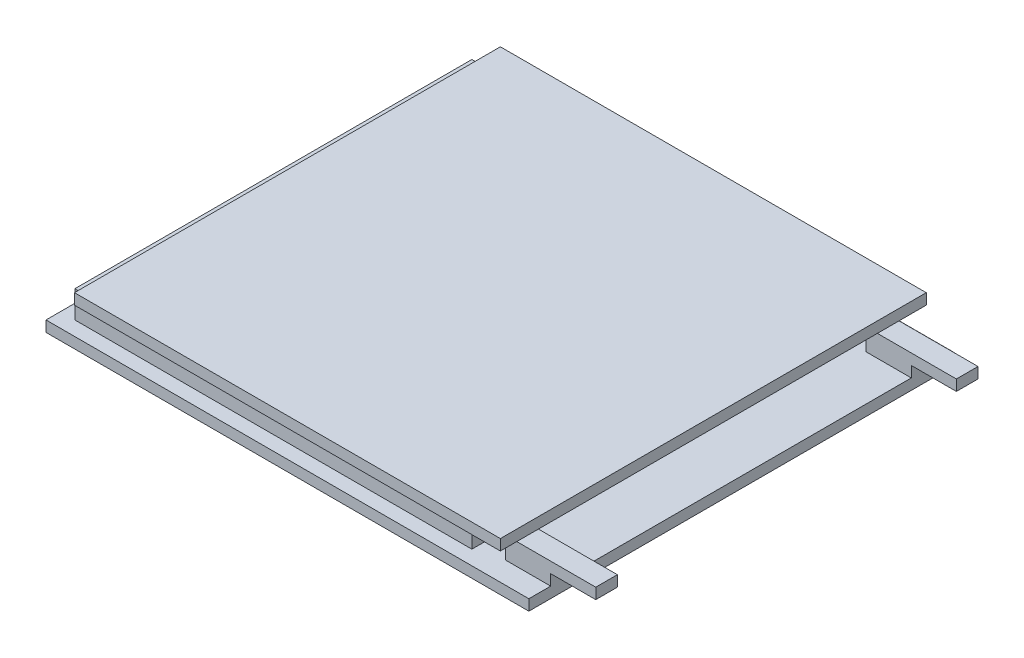
ISO-10303-21;
HEADER;
FILE_DESCRIPTION(('STEP AP214'),'2;1');
FILE_NAME('part.step','',(''),(''),'','','');
FILE_SCHEMA(('AUTOMOTIVE_DESIGN { 1 0 10303 214 1 1 1 1 }'));
ENDSEC;
DATA;
#1=APPLICATION_CONTEXT('core data for automotive mechanical design processes');
#2=APPLICATION_PROTOCOL_DEFINITION('international standard','automotive_design',2000,#1);
#3=PRODUCT_CONTEXT('',#1,'mechanical');
#4=PRODUCT('Part','Part','',(#3));
#5=PRODUCT_RELATED_PRODUCT_CATEGORY('part','',(#4));
#6=PRODUCT_DEFINITION_FORMATION('','',#4);
#7=PRODUCT_DEFINITION_CONTEXT('part definition',#1,'design');
#8=PRODUCT_DEFINITION('design','',#6,#7);
#9=PRODUCT_DEFINITION_SHAPE('','',#8);
#10=(LENGTH_UNIT() NAMED_UNIT(*) SI_UNIT(.MILLI.,.METRE.));
#11=(NAMED_UNIT(*) PLANE_ANGLE_UNIT() SI_UNIT($,.RADIAN.));
#12=(NAMED_UNIT(*) SI_UNIT($,.STERADIAN.) SOLID_ANGLE_UNIT());
#13=UNCERTAINTY_MEASURE_WITH_UNIT(LENGTH_MEASURE(1.E-05),#10,'distance_accuracy_value','');
#14=(GEOMETRIC_REPRESENTATION_CONTEXT(3) GLOBAL_UNCERTAINTY_ASSIGNED_CONTEXT((#13)) GLOBAL_UNIT_ASSIGNED_CONTEXT((#10,
#11,#12)) REPRESENTATION_CONTEXT('',''));
#15=CARTESIAN_POINT('',(0.,0.,0.));
#16=DIRECTION('',(0.,0.,1.));
#17=DIRECTION('',(1.,0.,0.));
#18=AXIS2_PLACEMENT_3D('',#15,#16,#17);
#19=CARTESIAN_POINT('',(-17.0053,0.,14.9987));
#20=DIRECTION('',(0.,1.,0.));
#21=DIRECTION('',(0.,0.,1.));
#22=AXIS2_PLACEMENT_3D('',#19,#20,#21);
#23=PLANE('',#22);
#24=DIRECTION('',(-1.,0.,0.));
#25=VECTOR('',#24,1.);
#26=CARTESIAN_POINT('',(11.9761,0.,-13.9827));
#27=LINE('',#26,#25);
#28=CARTESIAN_POINT('',(11.9761,0.,-13.9827));
#29=VERTEX_POINT('',#28);
#30=CARTESIAN_POINT('',(-15.9893,0.,-13.9827));
#31=VERTEX_POINT('',#30);
#32=EDGE_CURVE('E324',#29,#31,#27,.T.);
#33=ORIENTED_EDGE('',*,*,#32,.F.);
#34=DIRECTION('',(0.,0.,-1.));
#35=VECTOR('',#34,1.);
#36=CARTESIAN_POINT('',(11.9761,0.,13.9827));
#37=LINE('',#36,#35);
#38=CARTESIAN_POINT('',(11.9761,0.,13.9827));
#39=VERTEX_POINT('',#38);
#40=EDGE_CURVE('E321',#39,#29,#37,.T.);
#41=ORIENTED_EDGE('',*,*,#40,.F.);
#42=DIRECTION('',(1.,0.,0.));
#43=VECTOR('',#42,1.);
#44=CARTESIAN_POINT('',(11.9761,0.,13.9827));
#45=LINE('',#44,#43);
#46=CARTESIAN_POINT('',(-15.9893,0.,13.9827));
#47=VERTEX_POINT('',#46);
#48=EDGE_CURVE('E329',#47,#39,#45,.T.);
#49=ORIENTED_EDGE('',*,*,#48,.F.);
#50=DIRECTION('',(0.,0.,1.));
#51=VECTOR('',#50,1.);
#52=CARTESIAN_POINT('',(-15.9893,0.,13.9827));
#53=LINE('',#52,#51);
#54=EDGE_CURVE('E326',#31,#47,#53,.T.);
#55=ORIENTED_EDGE('',*,*,#54,.F.);
#56=EDGE_LOOP('',(#33,#41,#49,#55));
#57=FACE_BOUND('',#56,.T.);
#58=DIRECTION('',(0.,0.,1.));
#59=VECTOR('',#58,1.);
#60=CARTESIAN_POINT('',(13.8303,0.,-13.462));
#61=LINE('',#60,#59);
#62=CARTESIAN_POINT('',(13.8303,0.,-13.462));
#63=VERTEX_POINT('',#62);
#64=CARTESIAN_POINT('',(13.8303,0.,-11.938));
#65=VERTEX_POINT('',#64);
#66=EDGE_CURVE('E49',#63,#65,#61,.T.);
#67=ORIENTED_EDGE('',*,*,#66,.F.);
#68=DIRECTION('',(1.,0.,0.));
#69=VECTOR('',#68,1.);
#70=CARTESIAN_POINT('',(17.0053,0.,-13.462));
#71=LINE('',#70,#69);
#72=CARTESIAN_POINT('',(17.0053,0.,-13.462));
#73=VERTEX_POINT('',#72);
#74=EDGE_CURVE('E231',#63,#73,#71,.T.);
#75=ORIENTED_EDGE('',*,*,#74,.T.);
#76=DIRECTION('',(0.,0.,-1.));
#77=VECTOR('',#76,1.);
#78=CARTESIAN_POINT('',(17.0053,0.,-14.9987));
#79=LINE('',#78,#77);
#80=CARTESIAN_POINT('',(17.0053,0.,-14.9987));
#81=VERTEX_POINT('',#80);
#82=EDGE_CURVE('E359',#73,#81,#79,.T.);
#83=ORIENTED_EDGE('',*,*,#82,.T.);
#84=DIRECTION('',(-1.,0.,0.));
#85=VECTOR('',#84,1.);
#86=CARTESIAN_POINT('',(-17.0053,0.,-14.9987));
#87=LINE('',#86,#85);
#88=CARTESIAN_POINT('',(-17.0053,0.,-14.9987));
#89=VERTEX_POINT('',#88);
#90=EDGE_CURVE('E362',#81,#89,#87,.T.);
#91=ORIENTED_EDGE('',*,*,#90,.T.);
#92=DIRECTION('',(0.,0.,1.));
#93=VECTOR('',#92,1.);
#94=CARTESIAN_POINT('',(-17.0053,0.,-14.9987));
#95=LINE('',#94,#93);
#96=CARTESIAN_POINT('',(-17.0053,0.,14.9987));
#97=VERTEX_POINT('',#96);
#98=EDGE_CURVE('E353',#89,#97,#95,.T.);
#99=ORIENTED_EDGE('',*,*,#98,.T.);
#100=DIRECTION('',(1.,0.,0.));
#101=VECTOR('',#100,1.);
#102=CARTESIAN_POINT('',(-17.0053,0.,14.9987));
#103=LINE('',#102,#101);
#104=CARTESIAN_POINT('',(17.0053,0.,14.9987));
#105=VERTEX_POINT('',#104);
#106=EDGE_CURVE('E356',#97,#105,#103,.T.);
#107=ORIENTED_EDGE('',*,*,#106,.T.);
#108=CARTESIAN_POINT('',(17.0053,0.,13.462));
#109=VERTEX_POINT('',#108);
#110=EDGE_CURVE('E360',#105,#109,#79,.T.);
#111=ORIENTED_EDGE('',*,*,#110,.T.);
#112=DIRECTION('',(1.,0.,0.));
#113=VECTOR('',#112,1.);
#114=CARTESIAN_POINT('',(17.0053,0.,13.462));
#115=LINE('',#114,#113);
#116=CARTESIAN_POINT('',(13.8303,0.,13.462));
#117=VERTEX_POINT('',#116);
#118=EDGE_CURVE('E265',#117,#109,#115,.T.);
#119=ORIENTED_EDGE('',*,*,#118,.F.);
#120=DIRECTION('',(0.,0.,-1.));
#121=VECTOR('',#120,1.);
#122=CARTESIAN_POINT('',(13.8303,0.,13.462));
#123=LINE('',#122,#121);
#124=CARTESIAN_POINT('',(13.8303,0.,11.938));
#125=VERTEX_POINT('',#124);
#126=EDGE_CURVE('E279',#117,#125,#123,.T.);
#127=ORIENTED_EDGE('',*,*,#126,.T.);
#128=DIRECTION('',(1.,0.,0.));
#129=VECTOR('',#128,1.);
#130=CARTESIAN_POINT('',(17.0053,0.,11.938));
#131=LINE('',#130,#129);
#132=CARTESIAN_POINT('',(17.0053,0.,11.938));
#133=VERTEX_POINT('',#132);
#134=EDGE_CURVE('E251',#125,#133,#131,.T.);
#135=ORIENTED_EDGE('',*,*,#134,.T.);
#136=CARTESIAN_POINT('',(17.0053,0.,-11.938));
#137=VERTEX_POINT('',#136);
#138=EDGE_CURVE('E363',#133,#137,#79,.T.);
#139=ORIENTED_EDGE('',*,*,#138,.T.);
#140=DIRECTION('',(1.,0.,0.));
#141=VECTOR('',#140,1.);
#142=CARTESIAN_POINT('',(17.0053,0.,-11.938));
#143=LINE('',#142,#141);
#144=EDGE_CURVE('E54',#65,#137,#143,.T.);
#145=ORIENTED_EDGE('',*,*,#144,.F.);
#146=EDGE_LOOP('',(#67,#75,#83,#91,#99,#107,#111,#119,#127,#135,#139,#145));
#147=FACE_BOUND('',#146,.T.);
#148=ADVANCED_FACE('F30',(#57,#147),#23,.T.);
#149=CARTESIAN_POINT('',(-17.0053,-0.762,-14.9987));
#150=DIRECTION('',(-1.,0.,0.));
#151=DIRECTION('',(0.,0.,1.));
#152=AXIS2_PLACEMENT_3D('',#149,#150,#151);
#153=PLANE('',#152);
#154=ORIENTED_EDGE('',*,*,#98,.F.);
#155=DIRECTION('',(0.,1.,0.));
#156=VECTOR('',#155,1.);
#157=CARTESIAN_POINT('',(-17.0053,-0.762,-14.9987));
#158=LINE('',#157,#156);
#159=CARTESIAN_POINT('',(-17.0053,-0.762,-14.9987));
#160=VERTEX_POINT('',#159);
#161=EDGE_CURVE('E39',#160,#89,#158,.T.);
#162=ORIENTED_EDGE('',*,*,#161,.F.);
#163=DIRECTION('',(0.,0.,1.));
#164=VECTOR('',#163,1.);
#165=CARTESIAN_POINT('',(-17.0053,-0.762,-14.9987));
#166=LINE('',#165,#164);
#167=CARTESIAN_POINT('',(-17.0053,-0.762,14.9987));
#168=VERTEX_POINT('',#167);
#169=EDGE_CURVE('E366',#160,#168,#166,.T.);
#170=ORIENTED_EDGE('',*,*,#169,.T.);
#171=DIRECTION('',(0.,1.,0.));
#172=VECTOR('',#171,1.);
#173=CARTESIAN_POINT('',(-17.0053,-0.762,14.9987));
#174=LINE('',#173,#172);
#175=EDGE_CURVE('E34',#168,#97,#174,.T.);
#176=ORIENTED_EDGE('',*,*,#175,.T.);
#177=EDGE_LOOP('',(#154,#162,#170,#176));
#178=FACE_BOUND('',#177,.T.);
#179=ADVANCED_FACE('F32',(#178),#153,.T.);
#180=CARTESIAN_POINT('',(-17.0053,-0.762,-14.9987));
#181=DIRECTION('',(0.,0.,-1.));
#182=DIRECTION('',(-1.,0.,0.));
#183=AXIS2_PLACEMENT_3D('',#180,#181,#182);
#184=PLANE('',#183);
#185=ORIENTED_EDGE('',*,*,#90,.F.);
#186=DIRECTION('',(0.,1.,0.));
#187=VECTOR('',#186,1.);
#188=CARTESIAN_POINT('',(17.0053,-0.762,-14.9987));
#189=LINE('',#188,#187);
#190=CARTESIAN_POINT('',(17.0053,-0.762,-14.9987));
#191=VERTEX_POINT('',#190);
#192=EDGE_CURVE('E379',#191,#81,#189,.T.);
#193=ORIENTED_EDGE('',*,*,#192,.F.);
#194=DIRECTION('',(-1.,0.,0.));
#195=VECTOR('',#194,1.);
#196=CARTESIAN_POINT('',(-17.0053,-0.762,-14.9987));
#197=LINE('',#196,#195);
#198=EDGE_CURVE('E375',#191,#160,#197,.T.);
#199=ORIENTED_EDGE('',*,*,#198,.T.);
#200=ORIENTED_EDGE('',*,*,#161,.T.);
#201=EDGE_LOOP('',(#185,#193,#199,#200));
#202=FACE_BOUND('',#201,.T.);
#203=ADVANCED_FACE('F392',(#202),#184,.T.);
#204=CARTESIAN_POINT('',(17.0053,-0.762,-14.9987));
#205=DIRECTION('',(1.,0.,0.));
#206=DIRECTION('',(0.,0.,-1.));
#207=AXIS2_PLACEMENT_3D('',#204,#205,#206);
#208=PLANE('',#207);
#209=ORIENTED_EDGE('',*,*,#110,.F.);
#210=DIRECTION('',(0.,1.,0.));
#211=VECTOR('',#210,1.);
#212=CARTESIAN_POINT('',(17.0053,-0.762,14.9987));
#213=LINE('',#212,#211);
#214=CARTESIAN_POINT('',(17.0053,-0.762,14.9987));
#215=VERTEX_POINT('',#214);
#216=EDGE_CURVE('E381',#215,#105,#213,.T.);
#217=ORIENTED_EDGE('',*,*,#216,.F.);
#218=DIRECTION('',(0.,0.,-1.));
#219=VECTOR('',#218,1.);
#220=CARTESIAN_POINT('',(17.0053,-0.762,-14.9987));
#221=LINE('',#220,#219);
#222=EDGE_CURVE('E372',#215,#191,#221,.T.);
#223=ORIENTED_EDGE('',*,*,#222,.T.);
#224=ORIENTED_EDGE('',*,*,#192,.T.);
#225=ORIENTED_EDGE('',*,*,#82,.F.);
#226=DIRECTION('',(0.,1.,0.));
#227=VECTOR('',#226,1.);
#228=CARTESIAN_POINT('',(17.0053,0.761999999999999,-13.462));
#229=LINE('',#228,#227);
#230=CARTESIAN_POINT('',(17.0053,0.761999999999999,-13.462));
#231=VERTEX_POINT('',#230);
#232=EDGE_CURVE('E242',#73,#231,#229,.T.);
#233=ORIENTED_EDGE('',*,*,#232,.T.);
#234=DIRECTION('',(0.,0.,1.));
#235=VECTOR('',#234,1.);
#236=CARTESIAN_POINT('',(17.0053,0.761999999999999,-13.462));
#237=LINE('',#236,#235);
#238=CARTESIAN_POINT('',(17.0053,0.761999999999999,-11.938));
#239=VERTEX_POINT('',#238);
#240=EDGE_CURVE('E245',#231,#239,#237,.T.);
#241=ORIENTED_EDGE('',*,*,#240,.T.);
#242=DIRECTION('',(0.,1.,0.));
#243=VECTOR('',#242,1.);
#244=CARTESIAN_POINT('',(17.0053,0.761999999999999,-11.938));
#245=LINE('',#244,#243);
#246=EDGE_CURVE('E228',#137,#239,#245,.T.);
#247=ORIENTED_EDGE('',*,*,#246,.F.);
#248=ORIENTED_EDGE('',*,*,#138,.F.);
#249=DIRECTION('',(0.,1.,0.));
#250=VECTOR('',#249,1.);
#251=CARTESIAN_POINT('',(17.0053,0.761999999999999,11.938));
#252=LINE('',#251,#250);
#253=CARTESIAN_POINT('',(17.0053,0.761999999999999,11.938));
#254=VERTEX_POINT('',#253);
#255=EDGE_CURVE('E254',#133,#254,#252,.T.);
#256=ORIENTED_EDGE('',*,*,#255,.T.);
#257=DIRECTION('',(0.,0.,-1.));
#258=VECTOR('',#257,1.);
#259=CARTESIAN_POINT('',(17.0053,0.761999999999999,13.462));
#260=LINE('',#259,#258);
#261=CARTESIAN_POINT('',(17.0053,0.761999999999999,13.462));
#262=VERTEX_POINT('',#261);
#263=EDGE_CURVE('E290',#262,#254,#260,.T.);
#264=ORIENTED_EDGE('',*,*,#263,.F.);
#265=DIRECTION('',(0.,1.,0.));
#266=VECTOR('',#265,1.);
#267=CARTESIAN_POINT('',(17.0053,0.761999999999999,13.462));
#268=LINE('',#267,#266);
#269=EDGE_CURVE('E268',#109,#262,#268,.T.);
#270=ORIENTED_EDGE('',*,*,#269,.F.);
#271=EDGE_LOOP('',(#209,#217,#223,#224,#225,#233,#241,#247,#248,#256,#264,#270));
#272=FACE_BOUND('',#271,.T.);
#273=ADVANCED_FACE('F398',(#272),#208,.T.);
#274=CARTESIAN_POINT('',(-17.0053,-0.762,14.9987));
#275=DIRECTION('',(0.,0.,1.));
#276=DIRECTION('',(1.,0.,0.));
#277=AXIS2_PLACEMENT_3D('',#274,#275,#276);
#278=PLANE('',#277);
#279=ORIENTED_EDGE('',*,*,#106,.F.);
#280=ORIENTED_EDGE('',*,*,#175,.F.);
#281=DIRECTION('',(1.,0.,0.));
#282=VECTOR('',#281,1.);
#283=CARTESIAN_POINT('',(-17.0053,-0.762,14.9987));
#284=LINE('',#283,#282);
#285=EDGE_CURVE('E369',#168,#215,#284,.T.);
#286=ORIENTED_EDGE('',*,*,#285,.T.);
#287=ORIENTED_EDGE('',*,*,#216,.T.);
#288=EDGE_LOOP('',(#279,#280,#286,#287));
#289=FACE_BOUND('',#288,.T.);
#290=ADVANCED_FACE('F389',(#289),#278,.T.);
#291=CARTESIAN_POINT('',(-17.0053,-0.762,14.9987));
#292=DIRECTION('',(0.,1.,0.));
#293=DIRECTION('',(0.,0.,1.));
#294=AXIS2_PLACEMENT_3D('',#291,#292,#293);
#295=PLANE('',#294);
#296=ORIENTED_EDGE('',*,*,#169,.F.);
#297=ORIENTED_EDGE('',*,*,#198,.F.);
#298=ORIENTED_EDGE('',*,*,#222,.F.);
#299=ORIENTED_EDGE('',*,*,#285,.F.);
#300=EDGE_LOOP('',(#296,#297,#298,#299));
#301=FACE_BOUND('',#300,.T.);
#302=ADVANCED_FACE('F395',(#301),#295,.F.);
#303=CARTESIAN_POINT('',(11.9761,1.905,13.9827));
#304=DIRECTION('',(-1.,0.,0.));
#305=DIRECTION('',(0.,0.,1.));
#306=AXIS2_PLACEMENT_3D('',#303,#304,#305);
#307=PLANE('',#306);
#308=ORIENTED_EDGE('',*,*,#40,.T.);
#309=DIRECTION('',(0.,-1.,0.));
#310=VECTOR('',#309,1.);
#311=CARTESIAN_POINT('',(11.9761,1.905,-13.9827));
#312=LINE('',#311,#310);
#313=CARTESIAN_POINT('',(11.9761,1.905,-13.9827));
#314=VERTEX_POINT('',#313);
#315=EDGE_CURVE('E351',#314,#29,#312,.T.);
#316=ORIENTED_EDGE('',*,*,#315,.F.);
#317=DIRECTION('',(0.,0.,-1.));
#318=VECTOR('',#317,1.);
#319=CARTESIAN_POINT('',(11.9761,1.905,13.9827));
#320=LINE('',#319,#318);
#321=CARTESIAN_POINT('',(11.9761,1.905,13.9827));
#322=VERTEX_POINT('',#321);
#323=EDGE_CURVE('E331',#322,#314,#320,.T.);
#324=ORIENTED_EDGE('',*,*,#323,.F.);
#325=DIRECTION('',(0.,-1.,0.));
#326=VECTOR('',#325,1.);
#327=CARTESIAN_POINT('',(11.9761,1.905,13.9827));
#328=LINE('',#327,#326);
#329=EDGE_CURVE('E343',#322,#39,#328,.T.);
#330=ORIENTED_EDGE('',*,*,#329,.T.);
#331=EDGE_LOOP('',(#308,#316,#324,#330));
#332=FACE_BOUND('',#331,.T.);
#333=ADVANCED_FACE('F444',(#332),#307,.F.);
#334=CARTESIAN_POINT('',(11.9761,1.905,-13.9827));
#335=DIRECTION('',(0.,0.,1.));
#336=DIRECTION('',(1.,0.,0.));
#337=AXIS2_PLACEMENT_3D('',#334,#335,#336);
#338=PLANE('',#337);
#339=ORIENTED_EDGE('',*,*,#32,.T.);
#340=DIRECTION('',(0.,-1.,0.));
#341=VECTOR('',#340,1.);
#342=CARTESIAN_POINT('',(-15.9893,1.905,-13.9827));
#343=LINE('',#342,#341);
#344=CARTESIAN_POINT('',(-15.9893,1.905,-13.9827));
#345=VERTEX_POINT('',#344);
#346=EDGE_CURVE('E348',#345,#31,#343,.T.);
#347=ORIENTED_EDGE('',*,*,#346,.F.);
#348=DIRECTION('',(-1.,0.,0.));
#349=VECTOR('',#348,1.);
#350=CARTESIAN_POINT('',(11.9761,1.905,-13.9827));
#351=LINE('',#350,#349);
#352=CARTESIAN_POINT('',(-14.9987,1.905,-13.9827));
#353=VERTEX_POINT('',#352);
#354=EDGE_CURVE('E334',#353,#345,#351,.T.);
#355=ORIENTED_EDGE('',*,*,#354,.F.);
#356=EDGE_CURVE('E335',#314,#353,#351,.T.);
#357=ORIENTED_EDGE('',*,*,#356,.F.);
#358=ORIENTED_EDGE('',*,*,#315,.T.);
#359=EDGE_LOOP('',(#339,#347,#355,#357,#358));
#360=FACE_BOUND('',#359,.T.);
#361=ADVANCED_FACE('F468',(#360),#338,.F.);
#362=CARTESIAN_POINT('',(-15.9893,1.905,13.9827));
#363=DIRECTION('',(1.,0.,0.));
#364=DIRECTION('',(0.,0.,-1.));
#365=AXIS2_PLACEMENT_3D('',#362,#363,#364);
#366=PLANE('',#365);
#367=ORIENTED_EDGE('',*,*,#54,.T.);
#368=DIRECTION('',(0.,-1.,0.));
#369=VECTOR('',#368,1.);
#370=CARTESIAN_POINT('',(-15.9893,1.905,13.9827));
#371=LINE('',#370,#369);
#372=CARTESIAN_POINT('',(-15.9893,1.905,13.9827));
#373=VERTEX_POINT('',#372);
#374=EDGE_CURVE('E346',#373,#47,#371,.T.);
#375=ORIENTED_EDGE('',*,*,#374,.F.);
#376=DIRECTION('',(0.,0.,1.));
#377=VECTOR('',#376,1.);
#378=CARTESIAN_POINT('',(-15.9893,1.905,13.9827));
#379=LINE('',#378,#377);
#380=EDGE_CURVE('E338',#345,#373,#379,.T.);
#381=ORIENTED_EDGE('',*,*,#380,.F.);
#382=ORIENTED_EDGE('',*,*,#346,.T.);
#383=EDGE_LOOP('',(#367,#375,#381,#382));
#384=FACE_BOUND('',#383,.T.);
#385=ADVANCED_FACE('F475',(#384),#366,.F.);
#386=CARTESIAN_POINT('',(11.9761,1.905,13.9827));
#387=DIRECTION('',(0.,0.,-1.));
#388=DIRECTION('',(-1.,0.,0.));
#389=AXIS2_PLACEMENT_3D('',#386,#387,#388);
#390=PLANE('',#389);
#391=ORIENTED_EDGE('',*,*,#48,.T.);
#392=ORIENTED_EDGE('',*,*,#329,.F.);
#393=DIRECTION('',(1.,0.,0.));
#394=VECTOR('',#393,1.);
#395=CARTESIAN_POINT('',(11.9761,1.905,13.9827));
#396=LINE('',#395,#394);
#397=CARTESIAN_POINT('',(-14.9987,1.905,13.9827));
#398=VERTEX_POINT('',#397);
#399=EDGE_CURVE('E340',#398,#322,#396,.T.);
#400=ORIENTED_EDGE('',*,*,#399,.F.);
#401=EDGE_CURVE('E341',#373,#398,#396,.T.);
#402=ORIENTED_EDGE('',*,*,#401,.F.);
#403=ORIENTED_EDGE('',*,*,#374,.T.);
#404=EDGE_LOOP('',(#391,#392,#400,#402,#403));
#405=FACE_BOUND('',#404,.T.);
#406=ADVANCED_FACE('F482',(#405),#390,.F.);
#407=CARTESIAN_POINT('',(11.9761,1.905,-13.9827));
#408=DIRECTION('',(0.,1.,0.));
#409=DIRECTION('',(0.,0.,1.));
#410=AXIS2_PLACEMENT_3D('',#407,#408,#409);
#411=PLANE('',#410);
#412=DIRECTION('',(0.,0.,1.));
#413=VECTOR('',#412,1.);
#414=CARTESIAN_POINT('',(-14.9987,1.905,-14.9987));
#415=LINE('',#414,#413);
#416=EDGE_CURVE('E11',#353,#398,#415,.T.);
#417=ORIENTED_EDGE('',*,*,#416,.F.);
#418=ORIENTED_EDGE('',*,*,#354,.T.);
#419=ORIENTED_EDGE('',*,*,#380,.T.);
#420=ORIENTED_EDGE('',*,*,#401,.T.);
#421=EDGE_LOOP('',(#417,#418,#419,#420));
#422=FACE_BOUND('',#421,.T.);
#423=ADVANCED_FACE('F489',(#422),#411,.T.);
#424=CARTESIAN_POINT('',(-14.9987,1.905,14.9987));
#425=DIRECTION('',(0.,1.,0.));
#426=DIRECTION('',(0.,0.,1.));
#427=AXIS2_PLACEMENT_3D('',#424,#425,#426);
#428=PLANE('',#427);
#429=ORIENTED_EDGE('',*,*,#323,.T.);
#430=ORIENTED_EDGE('',*,*,#356,.T.);
#431=CARTESIAN_POINT('',(-14.9987,1.905,-14.9987));
#432=VERTEX_POINT('',#431);
#433=EDGE_CURVE('E41',#432,#353,#415,.T.);
#434=ORIENTED_EDGE('',*,*,#433,.F.);
#435=DIRECTION('',(-1.,0.,0.));
#436=VECTOR('',#435,1.);
#437=CARTESIAN_POINT('',(-14.9987,1.905,-14.9987));
#438=LINE('',#437,#436);
#439=CARTESIAN_POINT('',(14.9987,1.905,-14.9987));
#440=VERTEX_POINT('',#439);
#441=EDGE_CURVE('E298',#440,#432,#438,.T.);
#442=ORIENTED_EDGE('',*,*,#441,.F.);
#443=DIRECTION('',(0.,0.,-1.));
#444=VECTOR('',#443,1.);
#445=CARTESIAN_POINT('',(14.9987,1.905,-14.9987));
#446=LINE('',#445,#444);
#447=CARTESIAN_POINT('',(14.9987,1.905,14.9987));
#448=VERTEX_POINT('',#447);
#449=EDGE_CURVE('E296',#448,#440,#446,.T.);
#450=ORIENTED_EDGE('',*,*,#449,.F.);
#451=DIRECTION('',(1.,0.,0.));
#452=VECTOR('',#451,1.);
#453=CARTESIAN_POINT('',(-14.9987,1.905,14.9987));
#454=LINE('',#453,#452);
#455=CARTESIAN_POINT('',(-14.9987,1.905,14.9987));
#456=VERTEX_POINT('',#455);
#457=EDGE_CURVE('E294',#456,#448,#454,.T.);
#458=ORIENTED_EDGE('',*,*,#457,.F.);
#459=EDGE_CURVE('E42',#398,#456,#415,.T.);
#460=ORIENTED_EDGE('',*,*,#459,.F.);
#461=ORIENTED_EDGE('',*,*,#399,.T.);
#462=EDGE_LOOP('',(#429,#430,#434,#442,#450,#458,#460,#461));
#463=FACE_BOUND('',#462,.T.);
#464=ADVANCED_FACE('F497',(#463),#428,.F.);
#465=CARTESIAN_POINT('',(-14.9987,2.667,-14.9987));
#466=DIRECTION('',(1.,0.,0.));
#467=DIRECTION('',(0.,0.,-1.));
#468=AXIS2_PLACEMENT_3D('',#465,#466,#467);
#469=PLANE('',#468);
#470=ORIENTED_EDGE('',*,*,#433,.T.);
#471=ORIENTED_EDGE('',*,*,#416,.T.);
#472=ORIENTED_EDGE('',*,*,#459,.T.);
#473=DIRECTION('',(0.,-1.,0.));
#474=VECTOR('',#473,1.);
#475=CARTESIAN_POINT('',(-14.9987,2.667,14.9987));
#476=LINE('',#475,#474);
#477=CARTESIAN_POINT('',(-14.9987,2.667,14.9987));
#478=VERTEX_POINT('',#477);
#479=EDGE_CURVE('E318',#478,#456,#476,.T.);
#480=ORIENTED_EDGE('',*,*,#479,.F.);
#481=DIRECTION('',(0.,0.,1.));
#482=VECTOR('',#481,1.);
#483=CARTESIAN_POINT('',(-14.9987,2.667,-14.9987));
#484=LINE('',#483,#482);
#485=CARTESIAN_POINT('',(-14.9987,2.667,-14.9987));
#486=VERTEX_POINT('',#485);
#487=EDGE_CURVE('E300',#486,#478,#484,.T.);
#488=ORIENTED_EDGE('',*,*,#487,.F.);
#489=DIRECTION('',(0.,-1.,0.));
#490=VECTOR('',#489,1.);
#491=CARTESIAN_POINT('',(-14.9987,2.667,-14.9987));
#492=LINE('',#491,#490);
#493=EDGE_CURVE('E309',#486,#432,#492,.T.);
#494=ORIENTED_EDGE('',*,*,#493,.T.);
#495=EDGE_LOOP('',(#470,#471,#472,#480,#488,#494));
#496=FACE_BOUND('',#495,.T.);
#497=ADVANCED_FACE('F505',(#496),#469,.F.);
#498=CARTESIAN_POINT('',(-14.9987,2.667,14.9987));
#499=DIRECTION('',(0.,0.,-1.));
#500=DIRECTION('',(-1.,0.,0.));
#501=AXIS2_PLACEMENT_3D('',#498,#499,#500);
#502=PLANE('',#501);
#503=ORIENTED_EDGE('',*,*,#457,.T.);
#504=DIRECTION('',(0.,-1.,0.));
#505=VECTOR('',#504,1.);
#506=CARTESIAN_POINT('',(14.9987,2.667,14.9987));
#507=LINE('',#506,#505);
#508=CARTESIAN_POINT('',(14.9987,2.667,14.9987));
#509=VERTEX_POINT('',#508);
#510=EDGE_CURVE('E315',#509,#448,#507,.T.);
#511=ORIENTED_EDGE('',*,*,#510,.F.);
#512=DIRECTION('',(1.,0.,0.));
#513=VECTOR('',#512,1.);
#514=CARTESIAN_POINT('',(-14.9987,2.667,14.9987));
#515=LINE('',#514,#513);
#516=EDGE_CURVE('E303',#478,#509,#515,.T.);
#517=ORIENTED_EDGE('',*,*,#516,.F.);
#518=ORIENTED_EDGE('',*,*,#479,.T.);
#519=EDGE_LOOP('',(#503,#511,#517,#518));
#520=FACE_BOUND('',#519,.T.);
#521=ADVANCED_FACE('F513',(#520),#502,.F.);
#522=CARTESIAN_POINT('',(14.9987,2.667,-14.9987));
#523=DIRECTION('',(-1.,0.,0.));
#524=DIRECTION('',(0.,0.,1.));
#525=AXIS2_PLACEMENT_3D('',#522,#523,#524);
#526=PLANE('',#525);
#527=ORIENTED_EDGE('',*,*,#449,.T.);
#528=DIRECTION('',(0.,-1.,0.));
#529=VECTOR('',#528,1.);
#530=CARTESIAN_POINT('',(14.9987,2.667,-14.9987));
#531=LINE('',#530,#529);
#532=CARTESIAN_POINT('',(14.9987,2.667,-14.9987));
#533=VERTEX_POINT('',#532);
#534=EDGE_CURVE('E312',#533,#440,#531,.T.);
#535=ORIENTED_EDGE('',*,*,#534,.F.);
#536=DIRECTION('',(0.,0.,-1.));
#537=VECTOR('',#536,1.);
#538=CARTESIAN_POINT('',(14.9987,2.667,-14.9987));
#539=LINE('',#538,#537);
#540=EDGE_CURVE('E305',#509,#533,#539,.T.);
#541=ORIENTED_EDGE('',*,*,#540,.F.);
#542=ORIENTED_EDGE('',*,*,#510,.T.);
#543=EDGE_LOOP('',(#527,#535,#541,#542));
#544=FACE_BOUND('',#543,.T.);
#545=ADVANCED_FACE('F521',(#544),#526,.F.);
#546=CARTESIAN_POINT('',(-14.9987,2.667,-14.9987));
#547=DIRECTION('',(0.,0.,1.));
#548=DIRECTION('',(1.,0.,0.));
#549=AXIS2_PLACEMENT_3D('',#546,#547,#548);
#550=PLANE('',#549);
#551=ORIENTED_EDGE('',*,*,#441,.T.);
#552=ORIENTED_EDGE('',*,*,#493,.F.);
#553=DIRECTION('',(-1.,0.,0.));
#554=VECTOR('',#553,1.);
#555=CARTESIAN_POINT('',(-14.9987,2.667,-14.9987));
#556=LINE('',#555,#554);
#557=EDGE_CURVE('E307',#533,#486,#556,.T.);
#558=ORIENTED_EDGE('',*,*,#557,.F.);
#559=ORIENTED_EDGE('',*,*,#534,.T.);
#560=EDGE_LOOP('',(#551,#552,#558,#559));
#561=FACE_BOUND('',#560,.T.);
#562=ADVANCED_FACE('F529',(#561),#550,.F.);
#563=CARTESIAN_POINT('',(-14.9987,2.667,14.9987));
#564=DIRECTION('',(0.,1.,0.));
#565=DIRECTION('',(0.,0.,1.));
#566=AXIS2_PLACEMENT_3D('',#563,#564,#565);
#567=PLANE('',#566);
#568=ORIENTED_EDGE('',*,*,#487,.T.);
#569=ORIENTED_EDGE('',*,*,#516,.T.);
#570=ORIENTED_EDGE('',*,*,#540,.T.);
#571=ORIENTED_EDGE('',*,*,#557,.T.);
#572=EDGE_LOOP('',(#568,#569,#570,#571));
#573=FACE_BOUND('',#572,.T.);
#574=ADVANCED_FACE('F537',(#573),#567,.T.);
#575=CARTESIAN_POINT('',(20.1803,0.761999999999999,13.462));
#576=DIRECTION('',(0.,1.,0.));
#577=DIRECTION('',(-1.,0.,0.));
#578=AXIS2_PLACEMENT_3D('',#575,#576,#577);
#579=PLANE('',#578);
#580=DIRECTION('',(1.,0.,0.));
#581=VECTOR('',#580,1.);
#582=CARTESIAN_POINT('',(20.1803,0.761999999999999,11.938));
#583=LINE('',#582,#581);
#584=CARTESIAN_POINT('',(20.1803,0.761999999999999,11.938));
#585=VERTEX_POINT('',#584);
#586=EDGE_CURVE('E256',#254,#585,#583,.T.);
#587=ORIENTED_EDGE('',*,*,#586,.T.);
#588=DIRECTION('',(0.,0.,-1.));
#589=VECTOR('',#588,1.);
#590=CARTESIAN_POINT('',(20.1803,0.761999999999999,13.462));
#591=LINE('',#590,#589);
#592=CARTESIAN_POINT('',(20.1803,0.761999999999999,13.462));
#593=VERTEX_POINT('',#592);
#594=EDGE_CURVE('E287',#593,#585,#591,.T.);
#595=ORIENTED_EDGE('',*,*,#594,.F.);
#596=DIRECTION('',(1.,0.,0.));
#597=VECTOR('',#596,1.);
#598=CARTESIAN_POINT('',(20.1803,0.761999999999999,13.462));
#599=LINE('',#598,#597);
#600=EDGE_CURVE('E270',#262,#593,#599,.T.);
#601=ORIENTED_EDGE('',*,*,#600,.F.);
#602=ORIENTED_EDGE('',*,*,#263,.T.);
#603=EDGE_LOOP('',(#587,#595,#601,#602));
#604=FACE_BOUND('',#603,.T.);
#605=ADVANCED_FACE('F545',(#604),#579,.F.);
#606=CARTESIAN_POINT('',(20.1803,1.524,13.462));
#607=DIRECTION('',(-1.,0.,0.));
#608=DIRECTION('',(0.,0.,1.));
#609=AXIS2_PLACEMENT_3D('',#606,#607,#608);
#610=PLANE('',#609);
#611=DIRECTION('',(0.,1.,0.));
#612=VECTOR('',#611,1.);
#613=CARTESIAN_POINT('',(20.1803,1.524,11.938));
#614=LINE('',#613,#612);
#615=CARTESIAN_POINT('',(20.1803,1.524,11.938));
#616=VERTEX_POINT('',#615);
#617=EDGE_CURVE('E258',#585,#616,#614,.T.);
#618=ORIENTED_EDGE('',*,*,#617,.T.);
#619=DIRECTION('',(0.,0.,-1.));
#620=VECTOR('',#619,1.);
#621=CARTESIAN_POINT('',(20.1803,1.524,13.462));
#622=LINE('',#621,#620);
#623=CARTESIAN_POINT('',(20.1803,1.524,13.462));
#624=VERTEX_POINT('',#623);
#625=EDGE_CURVE('E284',#624,#616,#622,.T.);
#626=ORIENTED_EDGE('',*,*,#625,.F.);
#627=DIRECTION('',(0.,1.,0.));
#628=VECTOR('',#627,1.);
#629=CARTESIAN_POINT('',(20.1803,1.524,13.462));
#630=LINE('',#629,#628);
#631=EDGE_CURVE('E272',#593,#624,#630,.T.);
#632=ORIENTED_EDGE('',*,*,#631,.F.);
#633=ORIENTED_EDGE('',*,*,#594,.T.);
#634=EDGE_LOOP('',(#618,#626,#632,#633));
#635=FACE_BOUND('',#634,.T.);
#636=ADVANCED_FACE('F553',(#635),#610,.F.);
#637=CARTESIAN_POINT('',(13.8303,1.524,13.462));
#638=DIRECTION('',(0.,-1.,0.));
#639=DIRECTION('',(1.,0.,0.));
#640=AXIS2_PLACEMENT_3D('',#637,#638,#639);
#641=PLANE('',#640);
#642=DIRECTION('',(-1.,0.,0.));
#643=VECTOR('',#642,1.);
#644=CARTESIAN_POINT('',(13.8303,1.524,11.938));
#645=LINE('',#644,#643);
#646=CARTESIAN_POINT('',(13.8303,1.524,11.938));
#647=VERTEX_POINT('',#646);
#648=EDGE_CURVE('E260',#616,#647,#645,.T.);
#649=ORIENTED_EDGE('',*,*,#648,.T.);
#650=DIRECTION('',(0.,0.,-1.));
#651=VECTOR('',#650,1.);
#652=CARTESIAN_POINT('',(13.8303,1.524,13.462));
#653=LINE('',#652,#651);
#654=CARTESIAN_POINT('',(13.8303,1.524,13.462));
#655=VERTEX_POINT('',#654);
#656=EDGE_CURVE('E281',#655,#647,#653,.T.);
#657=ORIENTED_EDGE('',*,*,#656,.F.);
#658=DIRECTION('',(-1.,0.,0.));
#659=VECTOR('',#658,1.);
#660=CARTESIAN_POINT('',(13.8303,1.524,13.462));
#661=LINE('',#660,#659);
#662=EDGE_CURVE('E274',#624,#655,#661,.T.);
#663=ORIENTED_EDGE('',*,*,#662,.F.);
#664=ORIENTED_EDGE('',*,*,#625,.T.);
#665=EDGE_LOOP('',(#649,#657,#663,#664));
#666=FACE_BOUND('',#665,.T.);
#667=ADVANCED_FACE('F561',(#666),#641,.F.);
#668=CARTESIAN_POINT('',(13.8303,0.,13.462));
#669=DIRECTION('',(1.,0.,0.));
#670=DIRECTION('',(0.,0.,-1.));
#671=AXIS2_PLACEMENT_3D('',#668,#669,#670);
#672=PLANE('',#671);
#673=DIRECTION('',(0.,-1.,0.));
#674=VECTOR('',#673,1.);
#675=CARTESIAN_POINT('',(13.8303,0.,11.938));
#676=LINE('',#675,#674);
#677=EDGE_CURVE('E262',#647,#125,#676,.T.);
#678=ORIENTED_EDGE('',*,*,#677,.T.);
#679=ORIENTED_EDGE('',*,*,#126,.F.);
#680=DIRECTION('',(0.,-1.,0.));
#681=VECTOR('',#680,1.);
#682=CARTESIAN_POINT('',(13.8303,0.,13.462));
#683=LINE('',#682,#681);
#684=EDGE_CURVE('E276',#655,#117,#683,.T.);
#685=ORIENTED_EDGE('',*,*,#684,.F.);
#686=ORIENTED_EDGE('',*,*,#656,.T.);
#687=EDGE_LOOP('',(#678,#679,#685,#686));
#688=FACE_BOUND('',#687,.T.);
#689=ADVANCED_FACE('F408',(#688),#672,.F.);
#690=CARTESIAN_POINT('',(13.8303,0.,13.462));
#691=DIRECTION('',(0.,0.,-1.));
#692=DIRECTION('',(-1.,0.,0.));
#693=AXIS2_PLACEMENT_3D('',#690,#691,#692);
#694=PLANE('',#693);
#695=ORIENTED_EDGE('',*,*,#118,.T.);
#696=ORIENTED_EDGE('',*,*,#269,.T.);
#697=ORIENTED_EDGE('',*,*,#600,.T.);
#698=ORIENTED_EDGE('',*,*,#631,.T.);
#699=ORIENTED_EDGE('',*,*,#662,.T.);
#700=ORIENTED_EDGE('',*,*,#684,.T.);
#701=EDGE_LOOP('',(#695,#696,#697,#698,#699,#700));
#702=FACE_BOUND('',#701,.T.);
#703=ADVANCED_FACE('F404',(#702),#694,.F.);
#704=CARTESIAN_POINT('',(13.8303,0.,11.938));
#705=DIRECTION('',(0.,0.,-1.));
#706=DIRECTION('',(-1.,0.,0.));
#707=AXIS2_PLACEMENT_3D('',#704,#705,#706);
#708=PLANE('',#707);
#709=ORIENTED_EDGE('',*,*,#134,.F.);
#710=ORIENTED_EDGE('',*,*,#677,.F.);
#711=ORIENTED_EDGE('',*,*,#648,.F.);
#712=ORIENTED_EDGE('',*,*,#617,.F.);
#713=ORIENTED_EDGE('',*,*,#586,.F.);
#714=ORIENTED_EDGE('',*,*,#255,.F.);
#715=EDGE_LOOP('',(#709,#710,#711,#712,#713,#714));
#716=FACE_BOUND('',#715,.T.);
#717=ADVANCED_FACE('F414',(#716),#708,.T.);
#718=CARTESIAN_POINT('',(13.8303,0.,-13.462));
#719=DIRECTION('',(-1.,0.,0.));
#720=DIRECTION('',(0.,0.,1.));
#721=AXIS2_PLACEMENT_3D('',#718,#719,#720);
#722=PLANE('',#721);
#723=DIRECTION('',(0.,-1.,0.));
#724=VECTOR('',#723,1.);
#725=CARTESIAN_POINT('',(13.8303,0.,-11.938));
#726=LINE('',#725,#724);
#727=CARTESIAN_POINT('',(13.8303,1.524,-11.938));
#728=VERTEX_POINT('',#727);
#729=EDGE_CURVE('E214',#728,#65,#726,.T.);
#730=ORIENTED_EDGE('',*,*,#729,.F.);
#731=DIRECTION('',(0.,0.,1.));
#732=VECTOR('',#731,1.);
#733=CARTESIAN_POINT('',(13.8303,1.524,-13.462));
#734=LINE('',#733,#732);
#735=CARTESIAN_POINT('',(13.8303,1.524,-13.462));
#736=VERTEX_POINT('',#735);
#737=EDGE_CURVE('E200',#736,#728,#734,.T.);
#738=ORIENTED_EDGE('',*,*,#737,.F.);
#739=DIRECTION('',(0.,-1.,0.));
#740=VECTOR('',#739,1.);
#741=CARTESIAN_POINT('',(13.8303,0.,-13.462));
#742=LINE('',#741,#740);
#743=EDGE_CURVE('E233',#736,#63,#742,.T.);
#744=ORIENTED_EDGE('',*,*,#743,.T.);
#745=ORIENTED_EDGE('',*,*,#66,.T.);
#746=EDGE_LOOP('',(#730,#738,#744,#745));
#747=FACE_BOUND('',#746,.T.);
#748=ADVANCED_FACE('F215',(#747),#722,.T.);
#749=CARTESIAN_POINT('',(13.8303,1.524,-13.462));
#750=DIRECTION('',(0.,1.,0.));
#751=DIRECTION('',(-1.,0.,0.));
#752=AXIS2_PLACEMENT_3D('',#749,#750,#751);
#753=PLANE('',#752);
#754=DIRECTION('',(-1.,0.,0.));
#755=VECTOR('',#754,1.);
#756=CARTESIAN_POINT('',(13.8303,1.524,-11.938));
#757=LINE('',#756,#755);
#758=CARTESIAN_POINT('',(20.1803,1.524,-11.938));
#759=VERTEX_POINT('',#758);
#760=EDGE_CURVE('E204',#759,#728,#757,.T.);
#761=ORIENTED_EDGE('',*,*,#760,.F.);
#762=DIRECTION('',(0.,0.,1.));
#763=VECTOR('',#762,1.);
#764=CARTESIAN_POINT('',(20.1803,1.524,-13.462));
#765=LINE('',#764,#763);
#766=CARTESIAN_POINT('',(20.1803,1.524,-13.462));
#767=VERTEX_POINT('',#766);
#768=EDGE_CURVE('E211',#767,#759,#765,.T.);
#769=ORIENTED_EDGE('',*,*,#768,.F.);
#770=DIRECTION('',(-1.,0.,0.));
#771=VECTOR('',#770,1.);
#772=CARTESIAN_POINT('',(13.8303,1.524,-13.462));
#773=LINE('',#772,#771);
#774=EDGE_CURVE('E207',#767,#736,#773,.T.);
#775=ORIENTED_EDGE('',*,*,#774,.T.);
#776=ORIENTED_EDGE('',*,*,#737,.T.);
#777=EDGE_LOOP('',(#761,#769,#775,#776));
#778=FACE_BOUND('',#777,.T.);
#779=ADVANCED_FACE('F202',(#778),#753,.T.);
#780=CARTESIAN_POINT('',(20.1803,1.524,-13.462));
#781=DIRECTION('',(1.,0.,0.));
#782=DIRECTION('',(0.,0.,-1.));
#783=AXIS2_PLACEMENT_3D('',#780,#781,#782);
#784=PLANE('',#783);
#785=DIRECTION('',(0.,1.,0.));
#786=VECTOR('',#785,1.);
#787=CARTESIAN_POINT('',(20.1803,1.524,-11.938));
#788=LINE('',#787,#786);
#789=CARTESIAN_POINT('',(20.1803,0.761999999999999,-11.938));
#790=VERTEX_POINT('',#789);
#791=EDGE_CURVE('E221',#790,#759,#788,.T.);
#792=ORIENTED_EDGE('',*,*,#791,.F.);
#793=DIRECTION('',(0.,0.,1.));
#794=VECTOR('',#793,1.);
#795=CARTESIAN_POINT('',(20.1803,0.761999999999999,-13.462));
#796=LINE('',#795,#794);
#797=CARTESIAN_POINT('',(20.1803,0.761999999999999,-13.462));
#798=VERTEX_POINT('',#797);
#799=EDGE_CURVE('E247',#798,#790,#796,.T.);
#800=ORIENTED_EDGE('',*,*,#799,.F.);
#801=DIRECTION('',(0.,1.,0.));
#802=VECTOR('',#801,1.);
#803=CARTESIAN_POINT('',(20.1803,1.524,-13.462));
#804=LINE('',#803,#802);
#805=EDGE_CURVE('E236',#798,#767,#804,.T.);
#806=ORIENTED_EDGE('',*,*,#805,.T.);
#807=ORIENTED_EDGE('',*,*,#768,.T.);
#808=EDGE_LOOP('',(#792,#800,#806,#807));
#809=FACE_BOUND('',#808,.T.);
#810=ADVANCED_FACE('F424',(#809),#784,.T.);
#811=CARTESIAN_POINT('',(20.1803,0.761999999999999,-13.462));
#812=DIRECTION('',(0.,-1.,0.));
#813=DIRECTION('',(1.,0.,0.));
#814=AXIS2_PLACEMENT_3D('',#811,#812,#813);
#815=PLANE('',#814);
#816=DIRECTION('',(1.,0.,0.));
#817=VECTOR('',#816,1.);
#818=CARTESIAN_POINT('',(20.1803,0.761999999999999,-11.938));
#819=LINE('',#818,#817);
#820=EDGE_CURVE('E223',#239,#790,#819,.T.);
#821=ORIENTED_EDGE('',*,*,#820,.F.);
#822=ORIENTED_EDGE('',*,*,#240,.F.);
#823=DIRECTION('',(1.,0.,0.));
#824=VECTOR('',#823,1.);
#825=CARTESIAN_POINT('',(20.1803,0.761999999999999,-13.462));
#826=LINE('',#825,#824);
#827=EDGE_CURVE('E239',#231,#798,#826,.T.);
#828=ORIENTED_EDGE('',*,*,#827,.T.);
#829=ORIENTED_EDGE('',*,*,#799,.T.);
#830=EDGE_LOOP('',(#821,#822,#828,#829));
#831=FACE_BOUND('',#830,.T.);
#832=ADVANCED_FACE('F421',(#831),#815,.T.);
#833=CARTESIAN_POINT('',(13.8303,0.,-13.462));
#834=DIRECTION('',(0.,0.,1.));
#835=DIRECTION('',(-1.,0.,0.));
#836=AXIS2_PLACEMENT_3D('',#833,#834,#835);
#837=PLANE('',#836);
#838=ORIENTED_EDGE('',*,*,#74,.F.);
#839=ORIENTED_EDGE('',*,*,#743,.F.);
#840=ORIENTED_EDGE('',*,*,#774,.F.);
#841=ORIENTED_EDGE('',*,*,#805,.F.);
#842=ORIENTED_EDGE('',*,*,#827,.F.);
#843=ORIENTED_EDGE('',*,*,#232,.F.);
#844=EDGE_LOOP('',(#838,#839,#840,#841,#842,#843));
#845=FACE_BOUND('',#844,.T.);
#846=ADVANCED_FACE('F426',(#845),#837,.F.);
#847=CARTESIAN_POINT('',(13.8303,0.,-11.938));
#848=DIRECTION('',(0.,0.,1.));
#849=DIRECTION('',(-1.,0.,0.));
#850=AXIS2_PLACEMENT_3D('',#847,#848,#849);
#851=PLANE('',#850);
#852=ORIENTED_EDGE('',*,*,#144,.T.);
#853=ORIENTED_EDGE('',*,*,#246,.T.);
#854=ORIENTED_EDGE('',*,*,#820,.T.);
#855=ORIENTED_EDGE('',*,*,#791,.T.);
#856=ORIENTED_EDGE('',*,*,#760,.T.);
#857=ORIENTED_EDGE('',*,*,#729,.T.);
#858=EDGE_LOOP('',(#852,#853,#854,#855,#856,#857));
#859=FACE_BOUND('',#858,.T.);
#860=ADVANCED_FACE('F218',(#859),#851,.T.);
#861=CLOSED_SHELL('',(#148,#179,#203,#273,#290,#302,#333,#361,#385,#406,#423,#464,#497,#521,
#545,#562,#574,#605,#636,#667,#689,#703,#717,#748,#779,#810,#832,#846,#860));
#862=MANIFOLD_SOLID_BREP('B2',#861);
#863=ADVANCED_BREP_SHAPE_REPRESENTATION('',(#18,#862),#14);
#864=SHAPE_DEFINITION_REPRESENTATION(#9,#863);
ENDSEC;
END-ISO-10303-21;
